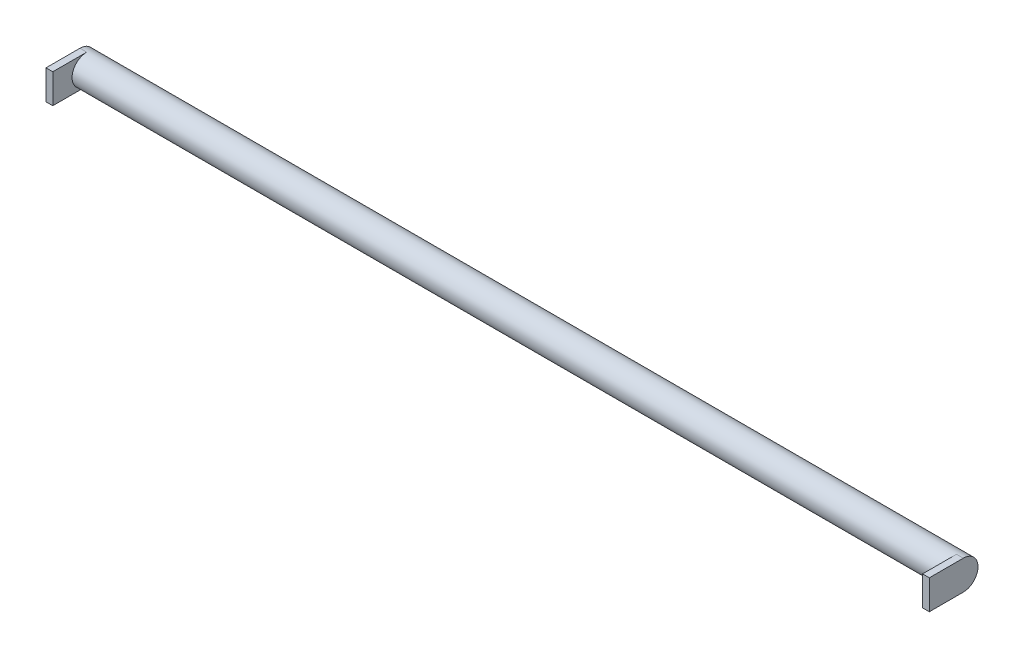
ISO-10303-21;
HEADER;
FILE_DESCRIPTION(('STEP AP214'),'2;1');
FILE_NAME('part.step','',(''),(''),'','','');
FILE_SCHEMA(('AUTOMOTIVE_DESIGN { 1 0 10303 214 1 1 1 1 }'));
ENDSEC;
DATA;
#1=APPLICATION_CONTEXT('core data for automotive mechanical design processes');
#2=APPLICATION_PROTOCOL_DEFINITION('international standard','automotive_design',2000,#1);
#3=PRODUCT_CONTEXT('',#1,'mechanical');
#4=PRODUCT('Part','Part','',(#3));
#5=PRODUCT_RELATED_PRODUCT_CATEGORY('part','',(#4));
#6=PRODUCT_DEFINITION_FORMATION('','',#4);
#7=PRODUCT_DEFINITION_CONTEXT('part definition',#1,'design');
#8=PRODUCT_DEFINITION('design','',#6,#7);
#9=PRODUCT_DEFINITION_SHAPE('','',#8);
#10=(LENGTH_UNIT() NAMED_UNIT(*) SI_UNIT(.MILLI.,.METRE.));
#11=(NAMED_UNIT(*) PLANE_ANGLE_UNIT() SI_UNIT($,.RADIAN.));
#12=(NAMED_UNIT(*) SI_UNIT($,.STERADIAN.) SOLID_ANGLE_UNIT());
#13=UNCERTAINTY_MEASURE_WITH_UNIT(LENGTH_MEASURE(1.E-05),#10,'distance_accuracy_value','');
#14=(GEOMETRIC_REPRESENTATION_CONTEXT(3) GLOBAL_UNCERTAINTY_ASSIGNED_CONTEXT((#13)) GLOBAL_UNIT_ASSIGNED_CONTEXT((#10,
#11,#12)) REPRESENTATION_CONTEXT('',''));
#15=CARTESIAN_POINT('',(0.,0.,0.));
#16=DIRECTION('',(0.,0.,1.));
#17=DIRECTION('',(1.,0.,0.));
#18=AXIS2_PLACEMENT_3D('',#15,#16,#17);
#19=CARTESIAN_POINT('',(-27.,-164.211474761492,-110.4));
#20=DIRECTION('',(0.,0.,1.));
#21=DIRECTION('',(1.,0.,0.));
#22=AXIS2_PLACEMENT_3D('',#19,#20,#21);
#23=PLANE('',#22);
#24=DIRECTION('',(0.,1.,0.));
#25=VECTOR('',#24,1.);
#26=CARTESIAN_POINT('',(-30.,-164.211474761492,-110.4));
#27=LINE('',#26,#25);
#28=CARTESIAN_POINT('',(-30.,-164.211474761492,-110.4));
#29=VERTEX_POINT('',#28);
#30=CARTESIAN_POINT('',(-30.,-151.211474761492,-110.4));
#31=VERTEX_POINT('',#30);
#32=EDGE_CURVE('E166',#29,#31,#27,.T.);
#33=ORIENTED_EDGE('',*,*,#32,.F.);
#34=DIRECTION('',(-1.,0.,0.));
#35=VECTOR('',#34,1.);
#36=CARTESIAN_POINT('',(-27.,-164.211474761492,-110.4));
#37=LINE('',#36,#35);
#38=CARTESIAN_POINT('',(-27.,-164.211474761492,-110.4));
#39=VERTEX_POINT('',#38);
#40=EDGE_CURVE('E49',#39,#29,#37,.T.);
#41=ORIENTED_EDGE('',*,*,#40,.F.);
#42=DIRECTION('',(0.,1.,0.));
#43=VECTOR('',#42,1.);
#44=CARTESIAN_POINT('',(-27.,-164.211474761492,-110.4));
#45=LINE('',#44,#43);
#46=CARTESIAN_POINT('',(-27.,-151.211474761492,-110.4));
#47=VERTEX_POINT('',#46);
#48=EDGE_CURVE('E168',#39,#47,#45,.T.);
#49=ORIENTED_EDGE('',*,*,#48,.T.);
#50=DIRECTION('',(-1.,0.,0.));
#51=VECTOR('',#50,1.);
#52=CARTESIAN_POINT('',(-27.,-151.211474761492,-110.4));
#53=LINE('',#52,#51);
#54=EDGE_CURVE('E42',#47,#31,#53,.T.);
#55=ORIENTED_EDGE('',*,*,#54,.T.);
#56=EDGE_LOOP('',(#33,#41,#49,#55));
#57=FACE_BOUND('',#56,.T.);
#58=ADVANCED_FACE('F39',(#57),#23,.T.);
#59=CARTESIAN_POINT('',(-27.,-164.211474761492,-125.4));
#60=DIRECTION('',(0.,-1.,0.));
#61=DIRECTION('',(1.,0.,0.));
#62=AXIS2_PLACEMENT_3D('',#59,#60,#61);
#63=PLANE('',#62);
#64=DIRECTION('',(0.,0.,1.));
#65=VECTOR('',#64,1.);
#66=CARTESIAN_POINT('',(-30.,-164.211474761492,-125.4));
#67=LINE('',#66,#65);
#68=CARTESIAN_POINT('',(-30.,-164.211474761492,-125.4));
#69=VERTEX_POINT('',#68);
#70=EDGE_CURVE('E172',#69,#29,#67,.T.);
#71=ORIENTED_EDGE('',*,*,#70,.F.);
#72=DIRECTION('',(-1.,0.,0.));
#73=VECTOR('',#72,1.);
#74=CARTESIAN_POINT('',(-27.,-164.211474761492,-125.4));
#75=LINE('',#74,#73);
#76=CARTESIAN_POINT('',(-27.,-164.211474761492,-125.4));
#77=VERTEX_POINT('',#76);
#78=EDGE_CURVE('E75',#77,#69,#75,.T.);
#79=ORIENTED_EDGE('',*,*,#78,.F.);
#80=DIRECTION('',(0.,0.,1.));
#81=VECTOR('',#80,1.);
#82=CARTESIAN_POINT('',(-27.,-164.211474761492,-125.4));
#83=LINE('',#82,#81);
#84=EDGE_CURVE('E175',#77,#39,#83,.T.);
#85=ORIENTED_EDGE('',*,*,#84,.T.);
#86=ORIENTED_EDGE('',*,*,#40,.T.);
#87=EDGE_LOOP('',(#71,#79,#85,#86));
#88=FACE_BOUND('',#87,.T.);
#89=ADVANCED_FACE('F203',(#88),#63,.T.);
#90=CARTESIAN_POINT('',(-27.,-157.711474761492,-125.4));
#91=DIRECTION('',(-1.,0.,0.));
#92=DIRECTION('',(0.,0.,1.));
#93=AXIS2_PLACEMENT_3D('',#90,#91,#92);
#94=CYLINDRICAL_SURFACE('',#93,6.50000000000001);
#95=CARTESIAN_POINT('',(-30.,-157.711474761492,-125.4));
#96=DIRECTION('',(-1.,0.,0.));
#97=DIRECTION('',(0.,0.,1.));
#98=AXIS2_PLACEMENT_3D('',#95,#96,#97);
#99=CIRCLE('',#98,6.50000000000001);
#100=CARTESIAN_POINT('',(-30.,-151.211474761492,-125.4));
#101=VERTEX_POINT('',#100);
#102=EDGE_CURVE('E185',#101,#69,#99,.T.);
#103=ORIENTED_EDGE('',*,*,#102,.F.);
#104=DIRECTION('',(-1.,0.,0.));
#105=VECTOR('',#104,1.);
#106=CARTESIAN_POINT('',(-27.,-151.211474761492,-125.4));
#107=LINE('',#106,#105);
#108=CARTESIAN_POINT('',(-27.,-151.211474761492,-125.4));
#109=VERTEX_POINT('',#108);
#110=EDGE_CURVE('E194',#109,#101,#107,.T.);
#111=ORIENTED_EDGE('',*,*,#110,.F.);
#112=CARTESIAN_POINT('',(-27.,-157.711474761492,-125.4));
#113=DIRECTION('',(-1.,0.,0.));
#114=DIRECTION('',(0.,0.,1.));
#115=AXIS2_PLACEMENT_3D('',#112,#113,#114);
#116=CIRCLE('',#115,6.5);
#117=EDGE_CURVE('E11',#77,#109,#116,.T.);
#118=ORIENTED_EDGE('',*,*,#117,.F.);
#119=ORIENTED_EDGE('',*,*,#78,.T.);
#120=EDGE_LOOP('',(#103,#111,#118,#119));
#121=FACE_BOUND('',#120,.T.);
#122=CARTESIAN_POINT('',(357.,-157.711474761492,-125.4));
#123=DIRECTION('',(-1.,0.,0.));
#124=DIRECTION('',(0.,0.,1.));
#125=AXIS2_PLACEMENT_3D('',#122,#123,#124);
#126=CIRCLE('',#125,6.5);
#127=CARTESIAN_POINT('',(357.,-164.211474761492,-125.4));
#128=VERTEX_POINT('',#127);
#129=CARTESIAN_POINT('',(357.,-151.211474761492,-125.4));
#130=VERTEX_POINT('',#129);
#131=EDGE_CURVE('E133',#128,#130,#126,.T.);
#132=ORIENTED_EDGE('',*,*,#131,.T.);
#133=DIRECTION('',(1.,0.,0.));
#134=VECTOR('',#133,1.);
#135=CARTESIAN_POINT('',(357.,-151.211474761492,-125.4));
#136=LINE('',#135,#134);
#137=CARTESIAN_POINT('',(360.,-151.211474761492,-125.4));
#138=VERTEX_POINT('',#137);
#139=EDGE_CURVE('E160',#130,#138,#136,.T.);
#140=ORIENTED_EDGE('',*,*,#139,.T.);
#141=CARTESIAN_POINT('',(360.,-157.711474761492,-125.4));
#142=DIRECTION('',(1.,0.,0.));
#143=DIRECTION('',(0.,0.,1.));
#144=AXIS2_PLACEMENT_3D('',#141,#142,#143);
#145=CIRCLE('',#144,6.50000000000001);
#146=CARTESIAN_POINT('',(360.,-164.211474761492,-125.4));
#147=VERTEX_POINT('',#146);
#148=EDGE_CURVE('E145',#147,#138,#145,.T.);
#149=ORIENTED_EDGE('',*,*,#148,.F.);
#150=DIRECTION('',(1.,0.,0.));
#151=VECTOR('',#150,1.);
#152=CARTESIAN_POINT('',(357.,-164.211474761492,-125.4));
#153=LINE('',#152,#151);
#154=EDGE_CURVE('E124',#128,#147,#153,.T.);
#155=ORIENTED_EDGE('',*,*,#154,.F.);
#156=EDGE_LOOP('',(#132,#140,#149,#155));
#157=FACE_BOUND('',#156,.T.);
#158=ADVANCED_FACE('F207',(#121,#157),#94,.T.);
#159=CARTESIAN_POINT('',(-27.,-151.211474761492,-110.4));
#160=DIRECTION('',(0.,1.,0.));
#161=DIRECTION('',(-1.,0.,0.));
#162=AXIS2_PLACEMENT_3D('',#159,#160,#161);
#163=PLANE('',#162);
#164=DIRECTION('',(0.,0.,-1.));
#165=VECTOR('',#164,1.);
#166=CARTESIAN_POINT('',(-30.,-151.211474761492,-110.4));
#167=LINE('',#166,#165);
#168=EDGE_CURVE('E181',#31,#101,#167,.T.);
#169=ORIENTED_EDGE('',*,*,#168,.F.);
#170=ORIENTED_EDGE('',*,*,#54,.F.);
#171=DIRECTION('',(0.,0.,-1.));
#172=VECTOR('',#171,1.);
#173=CARTESIAN_POINT('',(-27.,-151.211474761492,-110.4));
#174=LINE('',#173,#172);
#175=EDGE_CURVE('E171',#47,#109,#174,.T.);
#176=ORIENTED_EDGE('',*,*,#175,.T.);
#177=ORIENTED_EDGE('',*,*,#110,.T.);
#178=EDGE_LOOP('',(#169,#170,#176,#177));
#179=FACE_BOUND('',#178,.T.);
#180=ADVANCED_FACE('F200',(#179),#163,.T.);
#181=CARTESIAN_POINT('',(-27.,-157.711474761492,-125.4));
#182=DIRECTION('',(-1.,0.,0.));
#183=DIRECTION('',(0.,0.,1.));
#184=AXIS2_PLACEMENT_3D('',#181,#182,#183);
#185=PLANE('',#184);
#186=ORIENTED_EDGE('',*,*,#84,.F.);
#187=ORIENTED_EDGE('',*,*,#117,.T.);
#188=ORIENTED_EDGE('',*,*,#175,.F.);
#189=ORIENTED_EDGE('',*,*,#48,.F.);
#190=EDGE_LOOP('',(#186,#187,#188,#189));
#191=FACE_BOUND('',#190,.T.);
#192=ADVANCED_FACE('F206',(#191),#185,.F.);
#193=CARTESIAN_POINT('',(-30.,-157.711474761492,-125.4));
#194=DIRECTION('',(-1.,0.,0.));
#195=DIRECTION('',(0.,0.,1.));
#196=AXIS2_PLACEMENT_3D('',#193,#194,#195);
#197=PLANE('',#196);
#198=ORIENTED_EDGE('',*,*,#32,.T.);
#199=ORIENTED_EDGE('',*,*,#168,.T.);
#200=ORIENTED_EDGE('',*,*,#102,.T.);
#201=ORIENTED_EDGE('',*,*,#70,.T.);
#202=EDGE_LOOP('',(#198,#199,#200,#201));
#203=FACE_BOUND('',#202,.T.);
#204=ADVANCED_FACE('F202',(#203),#197,.T.);
#205=CARTESIAN_POINT('',(357.,-157.711474761492,-125.4));
#206=DIRECTION('',(-1.,0.,0.));
#207=DIRECTION('',(0.,0.,1.));
#208=AXIS2_PLACEMENT_3D('',#205,#206,#207);
#209=PLANE('',#208);
#210=ORIENTED_EDGE('',*,*,#131,.F.);
#211=DIRECTION('',(0.,0.,-1.));
#212=VECTOR('',#211,1.);
#213=CARTESIAN_POINT('',(357.,-164.211474761492,-110.4));
#214=LINE('',#213,#212);
#215=CARTESIAN_POINT('',(357.,-164.211474761492,-110.4));
#216=VERTEX_POINT('',#215);
#217=EDGE_CURVE('E116',#216,#128,#214,.T.);
#218=ORIENTED_EDGE('',*,*,#217,.F.);
#219=DIRECTION('',(0.,-1.,0.));
#220=VECTOR('',#219,1.);
#221=CARTESIAN_POINT('',(357.,-151.211474761492,-110.4));
#222=LINE('',#221,#220);
#223=CARTESIAN_POINT('',(357.,-151.211474761492,-110.4));
#224=VERTEX_POINT('',#223);
#225=EDGE_CURVE('E130',#224,#216,#222,.T.);
#226=ORIENTED_EDGE('',*,*,#225,.F.);
#227=DIRECTION('',(0.,0.,1.));
#228=VECTOR('',#227,1.);
#229=CARTESIAN_POINT('',(357.,-151.211474761492,-110.4));
#230=LINE('',#229,#228);
#231=EDGE_CURVE('E125',#130,#224,#230,.T.);
#232=ORIENTED_EDGE('',*,*,#231,.F.);
#233=EDGE_LOOP('',(#210,#218,#226,#232));
#234=FACE_BOUND('',#233,.T.);
#235=ADVANCED_FACE('F129',(#234),#209,.T.);
#236=CARTESIAN_POINT('',(357.,-151.211474761492,-110.4));
#237=DIRECTION('',(0.,0.,1.));
#238=DIRECTION('',(1.,0.,0.));
#239=AXIS2_PLACEMENT_3D('',#236,#237,#238);
#240=PLANE('',#239);
#241=DIRECTION('',(0.,-1.,0.));
#242=VECTOR('',#241,1.);
#243=CARTESIAN_POINT('',(360.,-151.211474761492,-110.4));
#244=LINE('',#243,#242);
#245=CARTESIAN_POINT('',(360.,-151.211474761492,-110.4));
#246=VERTEX_POINT('',#245);
#247=CARTESIAN_POINT('',(360.,-164.211474761492,-110.4));
#248=VERTEX_POINT('',#247);
#249=EDGE_CURVE('E150',#246,#248,#244,.T.);
#250=ORIENTED_EDGE('',*,*,#249,.F.);
#251=DIRECTION('',(1.,0.,0.));
#252=VECTOR('',#251,1.);
#253=CARTESIAN_POINT('',(357.,-151.211474761492,-110.4));
#254=LINE('',#253,#252);
#255=EDGE_CURVE('E138',#224,#246,#254,.T.);
#256=ORIENTED_EDGE('',*,*,#255,.F.);
#257=ORIENTED_EDGE('',*,*,#225,.T.);
#258=DIRECTION('',(1.,0.,0.));
#259=VECTOR('',#258,1.);
#260=CARTESIAN_POINT('',(357.,-164.211474761492,-110.4));
#261=LINE('',#260,#259);
#262=EDGE_CURVE('E113',#216,#248,#261,.T.);
#263=ORIENTED_EDGE('',*,*,#262,.T.);
#264=EDGE_LOOP('',(#250,#256,#257,#263));
#265=FACE_BOUND('',#264,.T.);
#266=ADVANCED_FACE('F137',(#265),#240,.T.);
#267=CARTESIAN_POINT('',(357.,-151.211474761492,-110.4));
#268=DIRECTION('',(0.,1.,0.));
#269=DIRECTION('',(-1.,0.,0.));
#270=AXIS2_PLACEMENT_3D('',#267,#268,#269);
#271=PLANE('',#270);
#272=DIRECTION('',(0.,0.,1.));
#273=VECTOR('',#272,1.);
#274=CARTESIAN_POINT('',(360.,-151.211474761492,-110.4));
#275=LINE('',#274,#273);
#276=EDGE_CURVE('E140',#138,#246,#275,.T.);
#277=ORIENTED_EDGE('',*,*,#276,.F.);
#278=ORIENTED_EDGE('',*,*,#139,.F.);
#279=ORIENTED_EDGE('',*,*,#231,.T.);
#280=ORIENTED_EDGE('',*,*,#255,.T.);
#281=EDGE_LOOP('',(#277,#278,#279,#280));
#282=FACE_BOUND('',#281,.T.);
#283=ADVANCED_FACE('F217',(#282),#271,.T.);
#284=CARTESIAN_POINT('',(357.,-164.211474761492,-110.4));
#285=DIRECTION('',(0.,-1.,0.));
#286=DIRECTION('',(1.,0.,0.));
#287=AXIS2_PLACEMENT_3D('',#284,#285,#286);
#288=PLANE('',#287);
#289=DIRECTION('',(0.,0.,-1.));
#290=VECTOR('',#289,1.);
#291=CARTESIAN_POINT('',(360.,-164.211474761492,-110.4));
#292=LINE('',#291,#290);
#293=EDGE_CURVE('E118',#248,#147,#292,.T.);
#294=ORIENTED_EDGE('',*,*,#293,.F.);
#295=ORIENTED_EDGE('',*,*,#262,.F.);
#296=ORIENTED_EDGE('',*,*,#217,.T.);
#297=ORIENTED_EDGE('',*,*,#154,.T.);
#298=EDGE_LOOP('',(#294,#295,#296,#297));
#299=FACE_BOUND('',#298,.T.);
#300=ADVANCED_FACE('F115',(#299),#288,.T.);
#301=CARTESIAN_POINT('',(360.,-157.711474761492,-125.4));
#302=DIRECTION('',(-1.,0.,0.));
#303=DIRECTION('',(0.,0.,1.));
#304=AXIS2_PLACEMENT_3D('',#301,#302,#303);
#305=PLANE('',#304);
#306=ORIENTED_EDGE('',*,*,#249,.T.);
#307=ORIENTED_EDGE('',*,*,#293,.T.);
#308=ORIENTED_EDGE('',*,*,#148,.T.);
#309=ORIENTED_EDGE('',*,*,#276,.T.);
#310=EDGE_LOOP('',(#306,#307,#308,#309));
#311=FACE_BOUND('',#310,.T.);
#312=ADVANCED_FACE('F215',(#311),#305,.F.);
#313=CLOSED_SHELL('',(#58,#89,#158,#180,#192,#204,#235,#266,#283,#300,#312));
#314=MANIFOLD_SOLID_BREP('B2',#313);
#315=ADVANCED_BREP_SHAPE_REPRESENTATION('',(#18,#314),#14);
#316=SHAPE_DEFINITION_REPRESENTATION(#9,#315);
ENDSEC;
END-ISO-10303-21;
